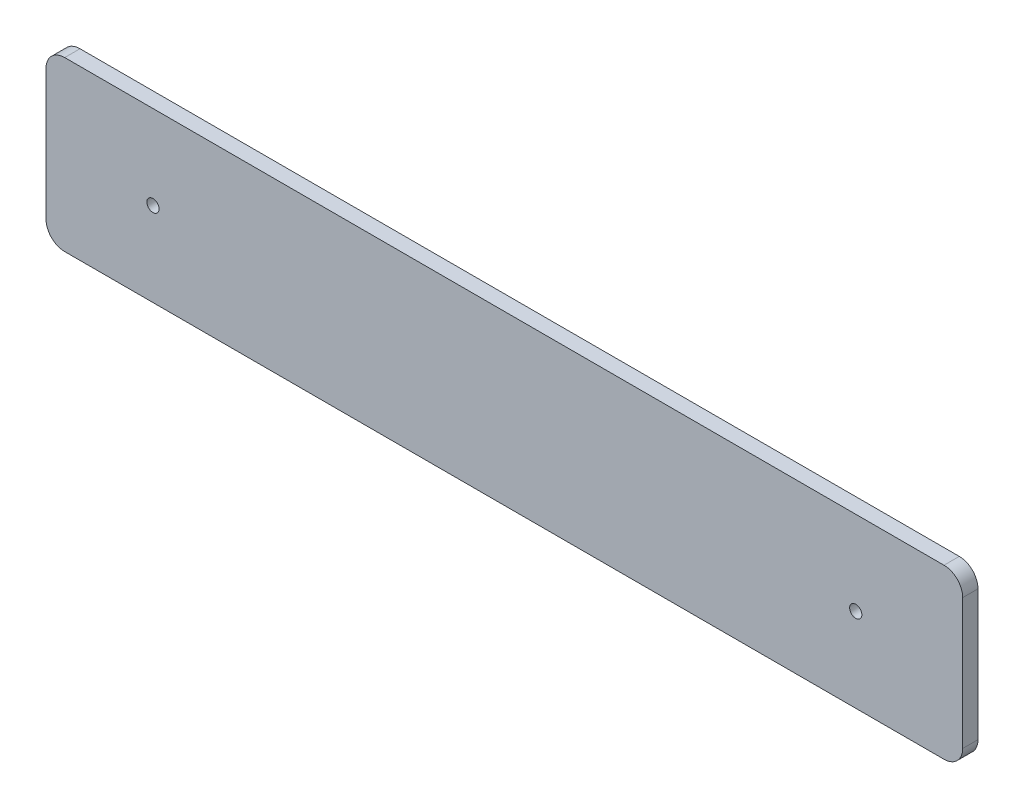
ISO-10303-21;
HEADER;
FILE_DESCRIPTION(('STEP AP214'),'2;1');
FILE_NAME('part.step','',(''),(''),'','','');
FILE_SCHEMA(('AUTOMOTIVE_DESIGN { 1 0 10303 214 1 1 1 1 }'));
ENDSEC;
DATA;
#1=APPLICATION_CONTEXT('core data for automotive mechanical design processes');
#2=APPLICATION_PROTOCOL_DEFINITION('international standard','automotive_design',2000,#1);
#3=PRODUCT_CONTEXT('',#1,'mechanical');
#4=PRODUCT('Part','Part','',(#3));
#5=PRODUCT_RELATED_PRODUCT_CATEGORY('part','',(#4));
#6=PRODUCT_DEFINITION_FORMATION('','',#4);
#7=PRODUCT_DEFINITION_CONTEXT('part definition',#1,'design');
#8=PRODUCT_DEFINITION('design','',#6,#7);
#9=PRODUCT_DEFINITION_SHAPE('','',#8);
#10=(LENGTH_UNIT() NAMED_UNIT(*) SI_UNIT(.MILLI.,.METRE.));
#11=(NAMED_UNIT(*) PLANE_ANGLE_UNIT() SI_UNIT($,.RADIAN.));
#12=(NAMED_UNIT(*) SI_UNIT($,.STERADIAN.) SOLID_ANGLE_UNIT());
#13=UNCERTAINTY_MEASURE_WITH_UNIT(LENGTH_MEASURE(1.E-05),#10,'distance_accuracy_value','');
#14=(GEOMETRIC_REPRESENTATION_CONTEXT(3) GLOBAL_UNCERTAINTY_ASSIGNED_CONTEXT((#13)) GLOBAL_UNIT_ASSIGNED_CONTEXT((#10,
#11,#12)) REPRESENTATION_CONTEXT('',''));
#15=CARTESIAN_POINT('',(0.,0.,0.));
#16=DIRECTION('',(0.,0.,1.));
#17=DIRECTION('',(1.,0.,0.));
#18=AXIS2_PLACEMENT_3D('',#15,#16,#17);
#19=CARTESIAN_POINT('',(1.22470963485319,-9.77529036514681,1.));
#20=DIRECTION('',(0.,0.,-1.));
#21=DIRECTION('',(-1.,0.,0.));
#22=AXIS2_PLACEMENT_3D('',#19,#20,#21);
#23=PLANE('',#22);
#24=CARTESIAN_POINT('',(1.22470963485319,-9.77529036514681,1.));
#25=DIRECTION('',(0.,0.,1.));
#26=DIRECTION('',(-1.,0.,0.));
#27=AXIS2_PLACEMENT_3D('',#24,#25,#26);
#28=CIRCLE('',#27,1.22470963485319);
#29=CARTESIAN_POINT('',(0.,-9.77529036514681,1.));
#30=VERTEX_POINT('',#29);
#31=CARTESIAN_POINT('',(1.22470963485319,-11.,1.));
#32=VERTEX_POINT('',#31);
#33=EDGE_CURVE('E164',#30,#32,#28,.T.);
#34=ORIENTED_EDGE('',*,*,#33,.T.);
#35=DIRECTION('',(1.,0.,0.));
#36=VECTOR('',#35,1.);
#37=CARTESIAN_POINT('',(1.22470963485319,-11.,1.));
#38=LINE('',#37,#36);
#39=CARTESIAN_POINT('',(58.7752903651468,-11.,1.));
#40=VERTEX_POINT('',#39);
#41=EDGE_CURVE('E100',#32,#40,#38,.T.);
#42=ORIENTED_EDGE('',*,*,#41,.T.);
#43=CARTESIAN_POINT('',(58.7752903651468,-9.77529036514681,1.));
#44=DIRECTION('',(0.,0.,1.));
#45=DIRECTION('',(1.,0.,0.));
#46=AXIS2_PLACEMENT_3D('',#43,#44,#45);
#47=CIRCLE('',#46,1.22470963485318);
#48=CARTESIAN_POINT('',(60.,-9.77529036514681,1.));
#49=VERTEX_POINT('',#48);
#50=EDGE_CURVE('E185',#40,#49,#47,.T.);
#51=ORIENTED_EDGE('',*,*,#50,.T.);
#52=DIRECTION('',(0.,1.,0.));
#53=VECTOR('',#52,1.);
#54=CARTESIAN_POINT('',(60.,-9.77529036514681,1.));
#55=LINE('',#54,#53);
#56=CARTESIAN_POINT('',(60.,-1.22470963485318,1.));
#57=VERTEX_POINT('',#56);
#58=EDGE_CURVE('E199',#49,#57,#55,.T.);
#59=ORIENTED_EDGE('',*,*,#58,.T.);
#60=CARTESIAN_POINT('',(58.7752903651468,-1.22470963485319,1.));
#61=DIRECTION('',(0.,0.,1.));
#62=DIRECTION('',(-1.,0.,0.));
#63=AXIS2_PLACEMENT_3D('',#60,#61,#62);
#64=CIRCLE('',#63,1.22470963485318);
#65=CARTESIAN_POINT('',(58.7752903651468,0.,1.));
#66=VERTEX_POINT('',#65);
#67=EDGE_CURVE('E119',#57,#66,#64,.T.);
#68=ORIENTED_EDGE('',*,*,#67,.T.);
#69=DIRECTION('',(-1.,0.,0.));
#70=VECTOR('',#69,1.);
#71=CARTESIAN_POINT('',(1.22470963485319,0.,1.));
#72=LINE('',#71,#70);
#73=CARTESIAN_POINT('',(1.22470963485319,0.,1.));
#74=VERTEX_POINT('',#73);
#75=EDGE_CURVE('E113',#66,#74,#72,.T.);
#76=ORIENTED_EDGE('',*,*,#75,.T.);
#77=CARTESIAN_POINT('',(1.22470963485319,-1.22470963485319,1.));
#78=DIRECTION('',(0.,0.,1.));
#79=DIRECTION('',(1.,0.,0.));
#80=AXIS2_PLACEMENT_3D('',#77,#78,#79);
#81=CIRCLE('',#80,1.22470963485319);
#82=CARTESIAN_POINT('',(0.,-1.22470963485319,1.));
#83=VERTEX_POINT('',#82);
#84=EDGE_CURVE('E117',#74,#83,#81,.T.);
#85=ORIENTED_EDGE('',*,*,#84,.T.);
#86=DIRECTION('',(0.,-1.,0.));
#87=VECTOR('',#86,1.);
#88=CARTESIAN_POINT('',(0.,-1.22470963485319,1.));
#89=LINE('',#88,#87);
#90=EDGE_CURVE('E57',#83,#30,#89,.T.);
#91=ORIENTED_EDGE('',*,*,#90,.T.);
#92=EDGE_LOOP('',(#34,#42,#51,#59,#68,#76,#85,#91));
#93=FACE_BOUND('',#92,.T.);
#94=CARTESIAN_POINT('',(7.,-5.5,1.));
#95=DIRECTION('',(0.,0.,1.));
#96=DIRECTION('',(1.,0.,0.));
#97=AXIS2_PLACEMENT_3D('',#94,#95,#96);
#98=CIRCLE('',#97,0.4);
#99=CARTESIAN_POINT('',(7.4,-5.5,1.));
#100=VERTEX_POINT('',#99);
#101=EDGE_CURVE('E146',#100,#100,#98,.T.);
#102=ORIENTED_EDGE('',*,*,#101,.F.);
#103=EDGE_LOOP('',(#102));
#104=FACE_BOUND('',#103,.T.);
#105=CARTESIAN_POINT('',(53.,-5.5,1.));
#106=DIRECTION('',(0.,0.,1.));
#107=DIRECTION('',(-1.,0.,0.));
#108=AXIS2_PLACEMENT_3D('',#105,#106,#107);
#109=CIRCLE('',#108,0.399999999999999);
#110=CARTESIAN_POINT('',(52.6,-5.5,1.));
#111=VERTEX_POINT('',#110);
#112=EDGE_CURVE('E213',#111,#111,#109,.T.);
#113=ORIENTED_EDGE('',*,*,#112,.F.);
#114=EDGE_LOOP('',(#113));
#115=FACE_BOUND('',#114,.T.);
#116=ADVANCED_FACE('F39',(#93,#104,#115),#23,.F.);
#117=CARTESIAN_POINT('',(1.22470963485319,-9.77529036514681,0.));
#118=DIRECTION('',(0.,0.,-1.));
#119=DIRECTION('',(-1.,0.,0.));
#120=AXIS2_PLACEMENT_3D('',#117,#118,#119);
#121=PLANE('',#120);
#122=CARTESIAN_POINT('',(7.,-5.5,0.));
#123=DIRECTION('',(0.,0.,1.));
#124=DIRECTION('',(1.,0.,0.));
#125=AXIS2_PLACEMENT_3D('',#122,#123,#124);
#126=CIRCLE('',#125,0.4);
#127=CARTESIAN_POINT('',(7.4,-5.5,0.));
#128=VERTEX_POINT('',#127);
#129=EDGE_CURVE('E209',#128,#128,#126,.T.);
#130=ORIENTED_EDGE('',*,*,#129,.T.);
#131=EDGE_LOOP('',(#130));
#132=FACE_BOUND('',#131,.T.);
#133=CARTESIAN_POINT('',(1.22470963485319,-9.77529036514681,0.));
#134=DIRECTION('',(0.,0.,1.));
#135=DIRECTION('',(-1.,0.,0.));
#136=AXIS2_PLACEMENT_3D('',#133,#134,#135);
#137=CIRCLE('',#136,1.22470963485319);
#138=CARTESIAN_POINT('',(0.,-9.77529036514681,0.));
#139=VERTEX_POINT('',#138);
#140=CARTESIAN_POINT('',(1.22470963485319,-11.,0.));
#141=VERTEX_POINT('',#140);
#142=EDGE_CURVE('E141',#139,#141,#137,.T.);
#143=ORIENTED_EDGE('',*,*,#142,.F.);
#144=DIRECTION('',(0.,-1.,0.));
#145=VECTOR('',#144,1.);
#146=CARTESIAN_POINT('',(0.,-1.22470963485319,0.));
#147=LINE('',#146,#145);
#148=CARTESIAN_POINT('',(0.,-1.22470963485319,0.));
#149=VERTEX_POINT('',#148);
#150=EDGE_CURVE('E92',#149,#139,#147,.T.);
#151=ORIENTED_EDGE('',*,*,#150,.F.);
#152=CARTESIAN_POINT('',(1.22470963485319,-1.22470963485319,0.));
#153=DIRECTION('',(0.,0.,1.));
#154=DIRECTION('',(1.,0.,0.));
#155=AXIS2_PLACEMENT_3D('',#152,#153,#154);
#156=CIRCLE('',#155,1.22470963485319);
#157=CARTESIAN_POINT('',(1.22470963485319,0.,0.));
#158=VERTEX_POINT('',#157);
#159=EDGE_CURVE('E86',#158,#149,#156,.T.);
#160=ORIENTED_EDGE('',*,*,#159,.F.);
#161=DIRECTION('',(-1.,0.,0.));
#162=VECTOR('',#161,1.);
#163=CARTESIAN_POINT('',(1.22470963485319,0.,0.));
#164=LINE('',#163,#162);
#165=CARTESIAN_POINT('',(58.7752903651468,0.,0.));
#166=VERTEX_POINT('',#165);
#167=EDGE_CURVE('E128',#166,#158,#164,.T.);
#168=ORIENTED_EDGE('',*,*,#167,.F.);
#169=CARTESIAN_POINT('',(58.7752903651468,-1.22470963485319,0.));
#170=DIRECTION('',(0.,0.,1.));
#171=DIRECTION('',(-1.,0.,0.));
#172=AXIS2_PLACEMENT_3D('',#169,#170,#171);
#173=CIRCLE('',#172,1.22470963485318);
#174=CARTESIAN_POINT('',(60.,-1.22470963485318,0.));
#175=VERTEX_POINT('',#174);
#176=EDGE_CURVE('E155',#175,#166,#173,.T.);
#177=ORIENTED_EDGE('',*,*,#176,.F.);
#178=DIRECTION('',(0.,1.,0.));
#179=VECTOR('',#178,1.);
#180=CARTESIAN_POINT('',(60.,-9.77529036514681,0.));
#181=LINE('',#180,#179);
#182=CARTESIAN_POINT('',(60.,-9.77529036514681,0.));
#183=VERTEX_POINT('',#182);
#184=EDGE_CURVE('E152',#183,#175,#181,.T.);
#185=ORIENTED_EDGE('',*,*,#184,.F.);
#186=CARTESIAN_POINT('',(58.7752903651468,-9.77529036514681,0.));
#187=DIRECTION('',(0.,0.,1.));
#188=DIRECTION('',(1.,0.,0.));
#189=AXIS2_PLACEMENT_3D('',#186,#187,#188);
#190=CIRCLE('',#189,1.22470963485318);
#191=CARTESIAN_POINT('',(58.7752903651468,-11.,0.));
#192=VERTEX_POINT('',#191);
#193=EDGE_CURVE('E149',#192,#183,#190,.T.);
#194=ORIENTED_EDGE('',*,*,#193,.F.);
#195=DIRECTION('',(1.,0.,0.));
#196=VECTOR('',#195,1.);
#197=CARTESIAN_POINT('',(1.22470963485319,-11.,0.));
#198=LINE('',#197,#196);
#199=EDGE_CURVE('E145',#141,#192,#198,.T.);
#200=ORIENTED_EDGE('',*,*,#199,.F.);
#201=EDGE_LOOP('',(#143,#151,#160,#168,#177,#185,#194,#200));
#202=FACE_BOUND('',#201,.T.);
#203=CARTESIAN_POINT('',(53.,-5.5,0.));
#204=DIRECTION('',(0.,0.,1.));
#205=DIRECTION('',(-1.,0.,0.));
#206=AXIS2_PLACEMENT_3D('',#203,#204,#205);
#207=CIRCLE('',#206,0.399999999999999);
#208=CARTESIAN_POINT('',(52.6,-5.5,0.));
#209=VERTEX_POINT('',#208);
#210=EDGE_CURVE('E217',#209,#209,#207,.T.);
#211=ORIENTED_EDGE('',*,*,#210,.T.);
#212=EDGE_LOOP('',(#211));
#213=FACE_BOUND('',#212,.T.);
#214=ADVANCED_FACE('F189',(#132,#202,#213),#121,.T.);
#215=CARTESIAN_POINT('',(1.22470963485319,-9.77529036514681,1.));
#216=DIRECTION('',(0.,0.,-1.));
#217=DIRECTION('',(-1.,0.,0.));
#218=AXIS2_PLACEMENT_3D('',#215,#216,#217);
#219=CYLINDRICAL_SURFACE('',#218,1.22470963485319);
#220=ORIENTED_EDGE('',*,*,#142,.T.);
#221=DIRECTION('',(0.,0.,-1.));
#222=VECTOR('',#221,1.);
#223=CARTESIAN_POINT('',(1.22470963485319,-11.,1.));
#224=LINE('',#223,#222);
#225=EDGE_CURVE('E11',#32,#141,#224,.T.);
#226=ORIENTED_EDGE('',*,*,#225,.F.);
#227=ORIENTED_EDGE('',*,*,#33,.F.);
#228=DIRECTION('',(0.,0.,-1.));
#229=VECTOR('',#228,1.);
#230=CARTESIAN_POINT('',(0.,-9.77529036514681,1.));
#231=LINE('',#230,#229);
#232=EDGE_CURVE('E137',#30,#139,#231,.T.);
#233=ORIENTED_EDGE('',*,*,#232,.T.);
#234=EDGE_LOOP('',(#220,#226,#227,#233));
#235=FACE_BOUND('',#234,.T.);
#236=ADVANCED_FACE('F41',(#235),#219,.T.);
#237=CARTESIAN_POINT('',(1.22470963485319,-11.,1.));
#238=DIRECTION('',(0.,1.,0.));
#239=DIRECTION('',(0.,0.,1.));
#240=AXIS2_PLACEMENT_3D('',#237,#238,#239);
#241=PLANE('',#240);
#242=ORIENTED_EDGE('',*,*,#199,.T.);
#243=DIRECTION('',(0.,0.,-1.));
#244=VECTOR('',#243,1.);
#245=CARTESIAN_POINT('',(58.7752903651468,-11.,1.));
#246=LINE('',#245,#244);
#247=EDGE_CURVE('E49',#40,#192,#246,.T.);
#248=ORIENTED_EDGE('',*,*,#247,.F.);
#249=ORIENTED_EDGE('',*,*,#41,.F.);
#250=ORIENTED_EDGE('',*,*,#225,.T.);
#251=EDGE_LOOP('',(#242,#248,#249,#250));
#252=FACE_BOUND('',#251,.T.);
#253=ADVANCED_FACE('F251',(#252),#241,.F.);
#254=CARTESIAN_POINT('',(58.7752903651468,-9.77529036514681,1.));
#255=DIRECTION('',(0.,0.,-1.));
#256=DIRECTION('',(-1.,0.,0.));
#257=AXIS2_PLACEMENT_3D('',#254,#255,#256);
#258=CYLINDRICAL_SURFACE('',#257,1.22470963485318);
#259=ORIENTED_EDGE('',*,*,#193,.T.);
#260=DIRECTION('',(0.,0.,-1.));
#261=VECTOR('',#260,1.);
#262=CARTESIAN_POINT('',(60.,-9.77529036514681,1.));
#263=LINE('',#262,#261);
#264=EDGE_CURVE('E175',#49,#183,#263,.T.);
#265=ORIENTED_EDGE('',*,*,#264,.F.);
#266=ORIENTED_EDGE('',*,*,#50,.F.);
#267=ORIENTED_EDGE('',*,*,#247,.T.);
#268=EDGE_LOOP('',(#259,#265,#266,#267));
#269=FACE_BOUND('',#268,.T.);
#270=ADVANCED_FACE('F183',(#269),#258,.T.);
#271=CARTESIAN_POINT('',(60.,-9.77529036514681,1.));
#272=DIRECTION('',(-1.,0.,0.));
#273=DIRECTION('',(0.,0.,1.));
#274=AXIS2_PLACEMENT_3D('',#271,#272,#273);
#275=PLANE('',#274);
#276=ORIENTED_EDGE('',*,*,#184,.T.);
#277=DIRECTION('',(0.,0.,-1.));
#278=VECTOR('',#277,1.);
#279=CARTESIAN_POINT('',(60.,-1.22470963485318,1.));
#280=LINE('',#279,#278);
#281=EDGE_CURVE('E171',#57,#175,#280,.T.);
#282=ORIENTED_EDGE('',*,*,#281,.F.);
#283=ORIENTED_EDGE('',*,*,#58,.F.);
#284=ORIENTED_EDGE('',*,*,#264,.T.);
#285=EDGE_LOOP('',(#276,#282,#283,#284));
#286=FACE_BOUND('',#285,.T.);
#287=ADVANCED_FACE('F194',(#286),#275,.F.);
#288=CARTESIAN_POINT('',(58.7752903651468,-1.22470963485319,1.));
#289=DIRECTION('',(0.,0.,-1.));
#290=DIRECTION('',(-1.,0.,0.));
#291=AXIS2_PLACEMENT_3D('',#288,#289,#290);
#292=CYLINDRICAL_SURFACE('',#291,1.22470963485318);
#293=ORIENTED_EDGE('',*,*,#176,.T.);
#294=DIRECTION('',(0.,0.,-1.));
#295=VECTOR('',#294,1.);
#296=CARTESIAN_POINT('',(58.7752903651468,0.,1.));
#297=LINE('',#296,#295);
#298=EDGE_CURVE('E130',#66,#166,#297,.T.);
#299=ORIENTED_EDGE('',*,*,#298,.F.);
#300=ORIENTED_EDGE('',*,*,#67,.F.);
#301=ORIENTED_EDGE('',*,*,#281,.T.);
#302=EDGE_LOOP('',(#293,#299,#300,#301));
#303=FACE_BOUND('',#302,.T.);
#304=ADVANCED_FACE('F197',(#303),#292,.T.);
#305=CARTESIAN_POINT('',(1.22470963485319,0.,1.));
#306=DIRECTION('',(0.,-1.,0.));
#307=DIRECTION('',(0.,0.,-1.));
#308=AXIS2_PLACEMENT_3D('',#305,#306,#307);
#309=PLANE('',#308);
#310=ORIENTED_EDGE('',*,*,#167,.T.);
#311=DIRECTION('',(0.,0.,-1.));
#312=VECTOR('',#311,1.);
#313=CARTESIAN_POINT('',(1.22470963485319,0.,1.));
#314=LINE('',#313,#312);
#315=EDGE_CURVE('E125',#74,#158,#314,.T.);
#316=ORIENTED_EDGE('',*,*,#315,.F.);
#317=ORIENTED_EDGE('',*,*,#75,.F.);
#318=ORIENTED_EDGE('',*,*,#298,.T.);
#319=EDGE_LOOP('',(#310,#316,#317,#318));
#320=FACE_BOUND('',#319,.T.);
#321=ADVANCED_FACE('F126',(#320),#309,.F.);
#322=CARTESIAN_POINT('',(1.22470963485319,-1.22470963485319,1.));
#323=DIRECTION('',(0.,0.,-1.));
#324=DIRECTION('',(-1.,0.,0.));
#325=AXIS2_PLACEMENT_3D('',#322,#323,#324);
#326=CYLINDRICAL_SURFACE('',#325,1.22470963485319);
#327=ORIENTED_EDGE('',*,*,#159,.T.);
#328=DIRECTION('',(0.,0.,-1.));
#329=VECTOR('',#328,1.);
#330=CARTESIAN_POINT('',(0.,-1.22470963485319,1.));
#331=LINE('',#330,#329);
#332=EDGE_CURVE('E131',#83,#149,#331,.T.);
#333=ORIENTED_EDGE('',*,*,#332,.F.);
#334=ORIENTED_EDGE('',*,*,#84,.F.);
#335=ORIENTED_EDGE('',*,*,#315,.T.);
#336=EDGE_LOOP('',(#327,#333,#334,#335));
#337=FACE_BOUND('',#336,.T.);
#338=ADVANCED_FACE('F133',(#337),#326,.T.);
#339=CARTESIAN_POINT('',(0.,-1.22470963485319,1.));
#340=DIRECTION('',(1.,0.,0.));
#341=DIRECTION('',(0.,1.,0.));
#342=AXIS2_PLACEMENT_3D('',#339,#340,#341);
#343=PLANE('',#342);
#344=ORIENTED_EDGE('',*,*,#150,.T.);
#345=ORIENTED_EDGE('',*,*,#232,.F.);
#346=ORIENTED_EDGE('',*,*,#90,.F.);
#347=ORIENTED_EDGE('',*,*,#332,.T.);
#348=EDGE_LOOP('',(#344,#345,#346,#347));
#349=FACE_BOUND('',#348,.T.);
#350=ADVANCED_FACE('F239',(#349),#343,.F.);
#351=CARTESIAN_POINT('',(7.,-5.5,1.));
#352=DIRECTION('',(0.,0.,-1.));
#353=DIRECTION('',(-1.,0.,0.));
#354=AXIS2_PLACEMENT_3D('',#351,#352,#353);
#355=CYLINDRICAL_SURFACE('',#354,0.4);
#356=ORIENTED_EDGE('',*,*,#101,.T.);
#357=EDGE_LOOP('',(#356));
#358=FACE_BOUND('',#357,.T.);
#359=ORIENTED_EDGE('',*,*,#129,.F.);
#360=EDGE_LOOP('',(#359));
#361=FACE_BOUND('',#360,.T.);
#362=ADVANCED_FACE('F236',(#358,#361),#355,.F.);
#363=CARTESIAN_POINT('',(53.,-5.5,1.));
#364=DIRECTION('',(0.,0.,-1.));
#365=DIRECTION('',(-1.,0.,0.));
#366=AXIS2_PLACEMENT_3D('',#363,#364,#365);
#367=CYLINDRICAL_SURFACE('',#366,0.399999999999999);
#368=ORIENTED_EDGE('',*,*,#112,.T.);
#369=EDGE_LOOP('',(#368));
#370=FACE_BOUND('',#369,.T.);
#371=ORIENTED_EDGE('',*,*,#210,.F.);
#372=EDGE_LOOP('',(#371));
#373=FACE_BOUND('',#372,.T.);
#374=ADVANCED_FACE('F225',(#370,#373),#367,.F.);
#375=CLOSED_SHELL('',(#116,#214,#236,#253,#270,#287,#304,#321,#338,#350,#362,#374));
#376=MANIFOLD_SOLID_BREP('B2',#375);
#377=ADVANCED_BREP_SHAPE_REPRESENTATION('',(#18,#376),#14);
#378=SHAPE_DEFINITION_REPRESENTATION(#9,#377);
ENDSEC;
END-ISO-10303-21;
